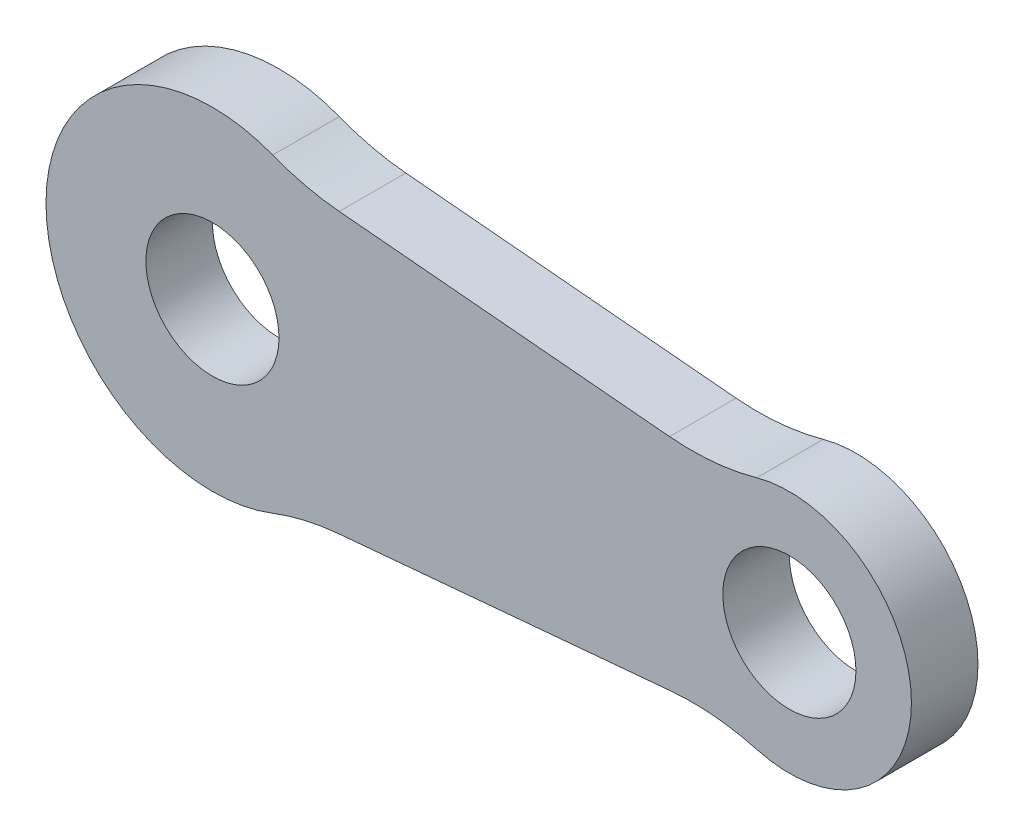
ISO-10303-21;
HEADER;
FILE_DESCRIPTION(('STEP AP214'),'2;1');
FILE_NAME('part.step','',(''),(''),'','','');
FILE_SCHEMA(('AUTOMOTIVE_DESIGN { 1 0 10303 214 1 1 1 1 }'));
ENDSEC;
DATA;
#1=APPLICATION_CONTEXT('core data for automotive mechanical design processes');
#2=APPLICATION_PROTOCOL_DEFINITION('international standard','automotive_design',2000,#1);
#3=PRODUCT_CONTEXT('',#1,'mechanical');
#4=PRODUCT('Part','Part','',(#3));
#5=PRODUCT_RELATED_PRODUCT_CATEGORY('part','',(#4));
#6=PRODUCT_DEFINITION_FORMATION('','',#4);
#7=PRODUCT_DEFINITION_CONTEXT('part definition',#1,'design');
#8=PRODUCT_DEFINITION('design','',#6,#7);
#9=PRODUCT_DEFINITION_SHAPE('','',#8);
#10=(LENGTH_UNIT() NAMED_UNIT(*) SI_UNIT(.MILLI.,.METRE.));
#11=(NAMED_UNIT(*) PLANE_ANGLE_UNIT() SI_UNIT($,.RADIAN.));
#12=(NAMED_UNIT(*) SI_UNIT($,.STERADIAN.) SOLID_ANGLE_UNIT());
#13=UNCERTAINTY_MEASURE_WITH_UNIT(LENGTH_MEASURE(1.E-05),#10,'distance_accuracy_value','');
#14=(GEOMETRIC_REPRESENTATION_CONTEXT(3) GLOBAL_UNCERTAINTY_ASSIGNED_CONTEXT((#13)) GLOBAL_UNIT_ASSIGNED_CONTEXT((#10,
#11,#12)) REPRESENTATION_CONTEXT('',''));
#15=CARTESIAN_POINT('',(0.,0.,0.));
#16=DIRECTION('',(0.,0.,1.));
#17=DIRECTION('',(1.,0.,0.));
#18=AXIS2_PLACEMENT_3D('',#15,#16,#17);
#19=CARTESIAN_POINT('',(33.5181089395637,86.2136089786035,15.));
#20=DIRECTION('',(0.,0.,-1.));
#21=DIRECTION('',(-1.,0.,0.));
#22=AXIS2_PLACEMENT_3D('',#19,#20,#21);
#23=PLANE('',#22);
#24=CARTESIAN_POINT('',(33.5181089395637,86.2136089786035,15.));
#25=DIRECTION('',(0.,0.,-1.));
#26=DIRECTION('',(-1.,0.,0.));
#27=AXIS2_PLACEMENT_3D('',#24,#25,#26);
#28=CIRCLE('',#27,55.);
#29=CARTESIAN_POINT('',(28.5728365165594,31.4363848734859,15.));
#30=VERTEX_POINT('',#29);
#31=CARTESIAN_POINT('',(13.5884225430664,34.9514630994339,15.));
#32=VERTEX_POINT('',#31);
#33=EDGE_CURVE('E229',#30,#32,#28,.T.);
#34=ORIENTED_EDGE('',*,*,#33,.T.);
#35=CARTESIAN_POINT('',(0.,0.,15.));
#36=DIRECTION('',(0.,0.,1.));
#37=DIRECTION('',(1.,0.,0.));
#38=AXIS2_PLACEMENT_3D('',#35,#36,#37);
#39=CIRCLE('',#38,37.5);
#40=CARTESIAN_POINT('',(13.4919163183759,-34.988829561132,15.));
#41=VERTEX_POINT('',#40);
#42=EDGE_CURVE('E155',#32,#41,#39,.T.);
#43=ORIENTED_EDGE('',*,*,#42,.T.);
#44=CARTESIAN_POINT('',(33.2800602519938,-86.3057795841255,15.));
#45=DIRECTION('',(0.,0.,1.));
#46=DIRECTION('',(1.,0.,0.));
#47=AXIS2_PLACEMENT_3D('',#44,#45,#46);
#48=CIRCLE('',#47,55.);
#49=CARTESIAN_POINT('',(28.3456044577617,-31.5275800334396,15.));
#50=VERTEX_POINT('',#49);
#51=EDGE_CURVE('E248',#50,#41,#48,.T.);
#52=ORIENTED_EDGE('',*,*,#51,.F.);
#53=DIRECTION('',(0.995967264557926,0.0897173780769479,0.));
#54=VECTOR('',#53,1.);
#55=CARTESIAN_POINT('',(28.3456044577617,-31.5275800334396,15.));
#56=LINE('',#55,#54);
#57=CARTESIAN_POINT('',(103.236165654066,-24.7813896390937,15.));
#58=VERTEX_POINT('',#57);
#59=EDGE_CURVE('E263',#50,#58,#56,.T.);
#60=ORIENTED_EDGE('',*,*,#59,.T.);
#61=CARTESIAN_POINT('',(108.170621448298,-79.5595891897796,15.));
#62=DIRECTION('',(0.,0.,-1.));
#63=DIRECTION('',(-1.,0.,0.));
#64=AXIS2_PLACEMENT_3D('',#61,#62,#63);
#65=CIRCLE('',#64,55.);
#66=CARTESIAN_POINT('',(122.723540482766,-26.5198630632599,15.));
#67=VERTEX_POINT('',#66);
#68=EDGE_CURVE('E178',#58,#67,#65,.T.);
#69=ORIENTED_EDGE('',*,*,#68,.T.);
#70=CARTESIAN_POINT('',(130.,0.,15.));
#71=DIRECTION('',(0.,0.,1.));
#72=DIRECTION('',(1.,0.,0.));
#73=AXIS2_PLACEMENT_3D('',#70,#71,#72);
#74=CIRCLE('',#73,27.5);
#75=CARTESIAN_POINT('',(122.645642045739,26.498366347392,15.));
#76=VERTEX_POINT('',#75);
#77=EDGE_CURVE('E171',#67,#76,#74,.T.);
#78=ORIENTED_EDGE('',*,*,#77,.T.);
#79=CARTESIAN_POINT('',(107.936926137217,79.4950990421759,15.));
#80=DIRECTION('',(0.,0.,1.));
#81=DIRECTION('',(1.,0.,0.));
#82=AXIS2_PLACEMENT_3D('',#79,#80,#81);
#83=CIRCLE('',#82,55.);
#84=CARTESIAN_POINT('',(102.991653714212,24.7178749370584,15.));
#85=VERTEX_POINT('',#84);
#86=EDGE_CURVE('E176',#85,#76,#83,.T.);
#87=ORIENTED_EDGE('',*,*,#86,.F.);
#88=DIRECTION('',(0.995949529183956,-0.0899140440546241,0.));
#89=VECTOR('',#88,1.);
#90=CARTESIAN_POINT('',(28.5728365165594,31.4363848734859,15.));
#91=LINE('',#90,#89);
#92=EDGE_CURVE('E196',#30,#85,#91,.T.);
#93=ORIENTED_EDGE('',*,*,#92,.F.);
#94=EDGE_LOOP('',(#34,#43,#52,#60,#69,#78,#87,#93));
#95=FACE_BOUND('',#94,.T.);
#96=CARTESIAN_POINT('',(0.,0.,15.));
#97=DIRECTION('',(0.,0.,1.));
#98=DIRECTION('',(1.,0.,0.));
#99=AXIS2_PLACEMENT_3D('',#96,#97,#98);
#100=CIRCLE('',#99,15.);
#101=CARTESIAN_POINT('',(15.,0.,15.));
#102=VERTEX_POINT('',#101);
#103=EDGE_CURVE('E206',#102,#102,#100,.T.);
#104=ORIENTED_EDGE('',*,*,#103,.F.);
#105=EDGE_LOOP('',(#104));
#106=FACE_BOUND('',#105,.T.);
#107=CARTESIAN_POINT('',(130.,0.,15.));
#108=DIRECTION('',(0.,0.,1.));
#109=DIRECTION('',(1.,0.,0.));
#110=AXIS2_PLACEMENT_3D('',#107,#108,#109);
#111=CIRCLE('',#110,15.);
#112=CARTESIAN_POINT('',(145.,0.,15.));
#113=VERTEX_POINT('',#112);
#114=EDGE_CURVE('E277',#113,#113,#111,.T.);
#115=ORIENTED_EDGE('',*,*,#114,.F.);
#116=EDGE_LOOP('',(#115));
#117=FACE_BOUND('',#116,.T.);
#118=ADVANCED_FACE('F99',(#95,#106,#117),#23,.F.);
#119=CARTESIAN_POINT('',(33.5181089395637,86.2136089786035,0.));
#120=DIRECTION('',(0.,0.,-1.));
#121=DIRECTION('',(-1.,0.,0.));
#122=AXIS2_PLACEMENT_3D('',#119,#120,#121);
#123=PLANE('',#122);
#124=CARTESIAN_POINT('',(0.,0.,0.));
#125=DIRECTION('',(0.,0.,1.));
#126=DIRECTION('',(1.,0.,0.));
#127=AXIS2_PLACEMENT_3D('',#124,#125,#126);
#128=CIRCLE('',#127,15.);
#129=CARTESIAN_POINT('',(15.,0.,0.));
#130=VERTEX_POINT('',#129);
#131=EDGE_CURVE('E273',#130,#130,#128,.T.);
#132=ORIENTED_EDGE('',*,*,#131,.T.);
#133=EDGE_LOOP('',(#132));
#134=FACE_BOUND('',#133,.T.);
#135=CARTESIAN_POINT('',(33.5181089395637,86.2136089786035,0.));
#136=DIRECTION('',(0.,0.,-1.));
#137=DIRECTION('',(-1.,0.,0.));
#138=AXIS2_PLACEMENT_3D('',#135,#136,#137);
#139=CIRCLE('',#138,55.);
#140=CARTESIAN_POINT('',(28.5728365165594,31.4363848734859,0.));
#141=VERTEX_POINT('',#140);
#142=CARTESIAN_POINT('',(13.5884225430664,34.9514630994339,0.));
#143=VERTEX_POINT('',#142);
#144=EDGE_CURVE('E202',#141,#143,#139,.T.);
#145=ORIENTED_EDGE('',*,*,#144,.F.);
#146=DIRECTION('',(0.995949529183956,-0.0899140440546241,0.));
#147=VECTOR('',#146,1.);
#148=CARTESIAN_POINT('',(28.5728365165594,31.4363848734859,0.));
#149=LINE('',#148,#147);
#150=CARTESIAN_POINT('',(102.991653714212,24.7178749370584,0.));
#151=VERTEX_POINT('',#150);
#152=EDGE_CURVE('E225',#141,#151,#149,.T.);
#153=ORIENTED_EDGE('',*,*,#152,.T.);
#154=CARTESIAN_POINT('',(107.936926137217,79.4950990421759,0.));
#155=DIRECTION('',(0.,0.,1.));
#156=DIRECTION('',(1.,0.,0.));
#157=AXIS2_PLACEMENT_3D('',#154,#155,#156);
#158=CIRCLE('',#157,55.);
#159=CARTESIAN_POINT('',(122.645642045739,26.498366347392,0.));
#160=VERTEX_POINT('',#159);
#161=EDGE_CURVE('E222',#151,#160,#158,.T.);
#162=ORIENTED_EDGE('',*,*,#161,.T.);
#163=CARTESIAN_POINT('',(130.,0.,0.));
#164=DIRECTION('',(0.,0.,1.));
#165=DIRECTION('',(1.,0.,0.));
#166=AXIS2_PLACEMENT_3D('',#163,#164,#165);
#167=CIRCLE('',#166,27.5);
#168=CARTESIAN_POINT('',(122.723540482766,-26.5198630632599,0.));
#169=VERTEX_POINT('',#168);
#170=EDGE_CURVE('E188',#169,#160,#167,.T.);
#171=ORIENTED_EDGE('',*,*,#170,.F.);
#172=CARTESIAN_POINT('',(108.170621448298,-79.5595891897796,0.));
#173=DIRECTION('',(0.,0.,-1.));
#174=DIRECTION('',(-1.,0.,0.));
#175=AXIS2_PLACEMENT_3D('',#172,#173,#174);
#176=CIRCLE('',#175,55.);
#177=CARTESIAN_POINT('',(103.236165654066,-24.7813896390937,0.));
#178=VERTEX_POINT('',#177);
#179=EDGE_CURVE('E217',#178,#169,#176,.T.);
#180=ORIENTED_EDGE('',*,*,#179,.F.);
#181=DIRECTION('',(0.995967264557926,0.0897173780769479,0.));
#182=VECTOR('',#181,1.);
#183=CARTESIAN_POINT('',(28.3456044577617,-31.5275800334396,0.));
#184=LINE('',#183,#182);
#185=CARTESIAN_POINT('',(28.3456044577617,-31.5275800334396,0.));
#186=VERTEX_POINT('',#185);
#187=EDGE_CURVE('E214',#186,#178,#184,.T.);
#188=ORIENTED_EDGE('',*,*,#187,.F.);
#189=CARTESIAN_POINT('',(33.2800602519938,-86.3057795841255,0.));
#190=DIRECTION('',(0.,0.,1.));
#191=DIRECTION('',(1.,0.,0.));
#192=AXIS2_PLACEMENT_3D('',#189,#190,#191);
#193=CIRCLE('',#192,55.);
#194=CARTESIAN_POINT('',(13.4919163183759,-34.988829561132,0.));
#195=VERTEX_POINT('',#194);
#196=EDGE_CURVE('E210',#186,#195,#193,.T.);
#197=ORIENTED_EDGE('',*,*,#196,.T.);
#198=CARTESIAN_POINT('',(0.,0.,0.));
#199=DIRECTION('',(0.,0.,1.));
#200=DIRECTION('',(1.,0.,0.));
#201=AXIS2_PLACEMENT_3D('',#198,#199,#200);
#202=CIRCLE('',#201,37.5);
#203=EDGE_CURVE('E205',#143,#195,#202,.T.);
#204=ORIENTED_EDGE('',*,*,#203,.F.);
#205=EDGE_LOOP('',(#145,#153,#162,#171,#180,#188,#197,#204));
#206=FACE_BOUND('',#205,.T.);
#207=CARTESIAN_POINT('',(130.,0.,0.));
#208=DIRECTION('',(0.,0.,1.));
#209=DIRECTION('',(1.,0.,0.));
#210=AXIS2_PLACEMENT_3D('',#207,#208,#209);
#211=CIRCLE('',#210,15.);
#212=CARTESIAN_POINT('',(145.,0.,0.));
#213=VERTEX_POINT('',#212);
#214=EDGE_CURVE('E281',#213,#213,#211,.T.);
#215=ORIENTED_EDGE('',*,*,#214,.T.);
#216=EDGE_LOOP('',(#215));
#217=FACE_BOUND('',#216,.T.);
#218=ADVANCED_FACE('F253',(#134,#206,#217),#123,.T.);
#219=CARTESIAN_POINT('',(33.5181089395637,86.2136089786035,15.));
#220=DIRECTION('',(0.,0.,-1.));
#221=DIRECTION('',(-1.,0.,0.));
#222=AXIS2_PLACEMENT_3D('',#219,#220,#221);
#223=CYLINDRICAL_SURFACE('',#222,55.);
#224=ORIENTED_EDGE('',*,*,#144,.T.);
#225=DIRECTION('',(0.,0.,-1.));
#226=VECTOR('',#225,1.);
#227=CARTESIAN_POINT('',(13.5884225430664,34.9514630994339,15.));
#228=LINE('',#227,#226);
#229=EDGE_CURVE('E12',#32,#143,#228,.T.);
#230=ORIENTED_EDGE('',*,*,#229,.F.);
#231=ORIENTED_EDGE('',*,*,#33,.F.);
#232=DIRECTION('',(0.,0.,-1.));
#233=VECTOR('',#232,1.);
#234=CARTESIAN_POINT('',(28.5728365165594,31.4363848734859,15.));
#235=LINE('',#234,#233);
#236=EDGE_CURVE('E117',#30,#141,#235,.T.);
#237=ORIENTED_EDGE('',*,*,#236,.T.);
#238=EDGE_LOOP('',(#224,#230,#231,#237));
#239=FACE_BOUND('',#238,.T.);
#240=ADVANCED_FACE('F101',(#239),#223,.F.);
#241=CARTESIAN_POINT('',(0.,0.,15.));
#242=DIRECTION('',(0.,0.,-1.));
#243=DIRECTION('',(-1.,0.,0.));
#244=AXIS2_PLACEMENT_3D('',#241,#242,#243);
#245=CYLINDRICAL_SURFACE('',#244,37.5);
#246=ORIENTED_EDGE('',*,*,#203,.T.);
#247=DIRECTION('',(0.,0.,-1.));
#248=VECTOR('',#247,1.);
#249=CARTESIAN_POINT('',(13.4919163183759,-34.988829561132,15.));
#250=LINE('',#249,#248);
#251=EDGE_CURVE('E109',#41,#195,#250,.T.);
#252=ORIENTED_EDGE('',*,*,#251,.F.);
#253=ORIENTED_EDGE('',*,*,#42,.F.);
#254=ORIENTED_EDGE('',*,*,#229,.T.);
#255=EDGE_LOOP('',(#246,#252,#253,#254));
#256=FACE_BOUND('',#255,.T.);
#257=ADVANCED_FACE('F249',(#256),#245,.T.);
#258=CARTESIAN_POINT('',(33.2800602519938,-86.3057795841255,15.));
#259=DIRECTION('',(0.,0.,-1.));
#260=DIRECTION('',(-1.,0.,0.));
#261=AXIS2_PLACEMENT_3D('',#258,#259,#260);
#262=CYLINDRICAL_SURFACE('',#261,55.);
#263=ORIENTED_EDGE('',*,*,#196,.F.);
#264=DIRECTION('',(0.,0.,-1.));
#265=VECTOR('',#264,1.);
#266=CARTESIAN_POINT('',(28.3456044577617,-31.5275800334396,15.));
#267=LINE('',#266,#265);
#268=EDGE_CURVE('E240',#50,#186,#267,.T.);
#269=ORIENTED_EDGE('',*,*,#268,.F.);
#270=ORIENTED_EDGE('',*,*,#51,.T.);
#271=ORIENTED_EDGE('',*,*,#251,.T.);
#272=EDGE_LOOP('',(#263,#269,#270,#271));
#273=FACE_BOUND('',#272,.T.);
#274=ADVANCED_FACE('F246',(#273),#262,.F.);
#275=CARTESIAN_POINT('',(28.3456044577617,-31.5275800334396,15.));
#276=DIRECTION('',(-0.0897173780769479,0.995967264557926,0.));
#277=DIRECTION('',(-0.995967264557926,-0.0897173780769479,0.));
#278=AXIS2_PLACEMENT_3D('',#275,#276,#277);
#279=PLANE('',#278);
#280=ORIENTED_EDGE('',*,*,#187,.T.);
#281=DIRECTION('',(0.,0.,-1.));
#282=VECTOR('',#281,1.);
#283=CARTESIAN_POINT('',(103.236165654066,-24.7813896390937,15.));
#284=LINE('',#283,#282);
#285=EDGE_CURVE('E236',#58,#178,#284,.T.);
#286=ORIENTED_EDGE('',*,*,#285,.F.);
#287=ORIENTED_EDGE('',*,*,#59,.F.);
#288=ORIENTED_EDGE('',*,*,#268,.T.);
#289=EDGE_LOOP('',(#280,#286,#287,#288));
#290=FACE_BOUND('',#289,.T.);
#291=ADVANCED_FACE('F258',(#290),#279,.F.);
#292=CARTESIAN_POINT('',(108.170621448298,-79.5595891897796,15.));
#293=DIRECTION('',(0.,0.,-1.));
#294=DIRECTION('',(-1.,0.,0.));
#295=AXIS2_PLACEMENT_3D('',#292,#293,#294);
#296=CYLINDRICAL_SURFACE('',#295,55.);
#297=ORIENTED_EDGE('',*,*,#179,.T.);
#298=DIRECTION('',(0.,0.,-1.));
#299=VECTOR('',#298,1.);
#300=CARTESIAN_POINT('',(122.723540482766,-26.5198630632599,15.));
#301=LINE('',#300,#299);
#302=EDGE_CURVE('E192',#67,#169,#301,.T.);
#303=ORIENTED_EDGE('',*,*,#302,.F.);
#304=ORIENTED_EDGE('',*,*,#68,.F.);
#305=ORIENTED_EDGE('',*,*,#285,.T.);
#306=EDGE_LOOP('',(#297,#303,#304,#305));
#307=FACE_BOUND('',#306,.T.);
#308=ADVANCED_FACE('F261',(#307),#296,.F.);
#309=CARTESIAN_POINT('',(130.,0.,15.));
#310=DIRECTION('',(0.,0.,-1.));
#311=DIRECTION('',(-1.,0.,0.));
#312=AXIS2_PLACEMENT_3D('',#309,#310,#311);
#313=CYLINDRICAL_SURFACE('',#312,27.5);
#314=ORIENTED_EDGE('',*,*,#170,.T.);
#315=DIRECTION('',(0.,0.,-1.));
#316=VECTOR('',#315,1.);
#317=CARTESIAN_POINT('',(122.645642045739,26.498366347392,15.));
#318=LINE('',#317,#316);
#319=EDGE_CURVE('E185',#76,#160,#318,.T.);
#320=ORIENTED_EDGE('',*,*,#319,.F.);
#321=ORIENTED_EDGE('',*,*,#77,.F.);
#322=ORIENTED_EDGE('',*,*,#302,.T.);
#323=EDGE_LOOP('',(#314,#320,#321,#322));
#324=FACE_BOUND('',#323,.T.);
#325=ADVANCED_FACE('F186',(#324),#313,.T.);
#326=CARTESIAN_POINT('',(107.936926137217,79.4950990421759,15.));
#327=DIRECTION('',(0.,0.,-1.));
#328=DIRECTION('',(-1.,0.,0.));
#329=AXIS2_PLACEMENT_3D('',#326,#327,#328);
#330=CYLINDRICAL_SURFACE('',#329,55.);
#331=ORIENTED_EDGE('',*,*,#161,.F.);
#332=DIRECTION('',(0.,0.,-1.));
#333=VECTOR('',#332,1.);
#334=CARTESIAN_POINT('',(102.991653714212,24.7178749370584,15.));
#335=LINE('',#334,#333);
#336=EDGE_CURVE('E143',#85,#151,#335,.T.);
#337=ORIENTED_EDGE('',*,*,#336,.F.);
#338=ORIENTED_EDGE('',*,*,#86,.T.);
#339=ORIENTED_EDGE('',*,*,#319,.T.);
#340=EDGE_LOOP('',(#331,#337,#338,#339));
#341=FACE_BOUND('',#340,.T.);
#342=ADVANCED_FACE('F194',(#341),#330,.F.);
#343=CARTESIAN_POINT('',(28.5728365165594,31.4363848734859,15.));
#344=DIRECTION('',(0.0899140440546241,0.995949529183956,0.));
#345=DIRECTION('',(-0.995949529183956,0.0899140440546241,0.));
#346=AXIS2_PLACEMENT_3D('',#343,#344,#345);
#347=PLANE('',#346);
#348=ORIENTED_EDGE('',*,*,#152,.F.);
#349=ORIENTED_EDGE('',*,*,#236,.F.);
#350=ORIENTED_EDGE('',*,*,#92,.T.);
#351=ORIENTED_EDGE('',*,*,#336,.T.);
#352=EDGE_LOOP('',(#348,#349,#350,#351));
#353=FACE_BOUND('',#352,.T.);
#354=ADVANCED_FACE('F303',(#353),#347,.T.);
#355=CARTESIAN_POINT('',(0.,0.,15.));
#356=DIRECTION('',(0.,0.,-1.));
#357=DIRECTION('',(-1.,0.,0.));
#358=AXIS2_PLACEMENT_3D('',#355,#356,#357);
#359=CYLINDRICAL_SURFACE('',#358,15.);
#360=ORIENTED_EDGE('',*,*,#103,.T.);
#361=EDGE_LOOP('',(#360));
#362=FACE_BOUND('',#361,.T.);
#363=ORIENTED_EDGE('',*,*,#131,.F.);
#364=EDGE_LOOP('',(#363));
#365=FACE_BOUND('',#364,.T.);
#366=ADVANCED_FACE('F300',(#362,#365),#359,.F.);
#367=CARTESIAN_POINT('',(130.,0.,15.));
#368=DIRECTION('',(0.,0.,-1.));
#369=DIRECTION('',(-1.,0.,0.));
#370=AXIS2_PLACEMENT_3D('',#367,#368,#369);
#371=CYLINDRICAL_SURFACE('',#370,15.);
#372=ORIENTED_EDGE('',*,*,#114,.T.);
#373=EDGE_LOOP('',(#372));
#374=FACE_BOUND('',#373,.T.);
#375=ORIENTED_EDGE('',*,*,#214,.F.);
#376=EDGE_LOOP('',(#375));
#377=FACE_BOUND('',#376,.T.);
#378=ADVANCED_FACE('F289',(#374,#377),#371,.F.);
#379=CLOSED_SHELL('',(#118,#218,#240,#257,#274,#291,#308,#325,#342,#354,#366,#378));
#380=MANIFOLD_SOLID_BREP('B2',#379);
#381=ADVANCED_BREP_SHAPE_REPRESENTATION('',(#18,#380),#14);
#382=SHAPE_DEFINITION_REPRESENTATION(#9,#381);
ENDSEC;
END-ISO-10303-21;
